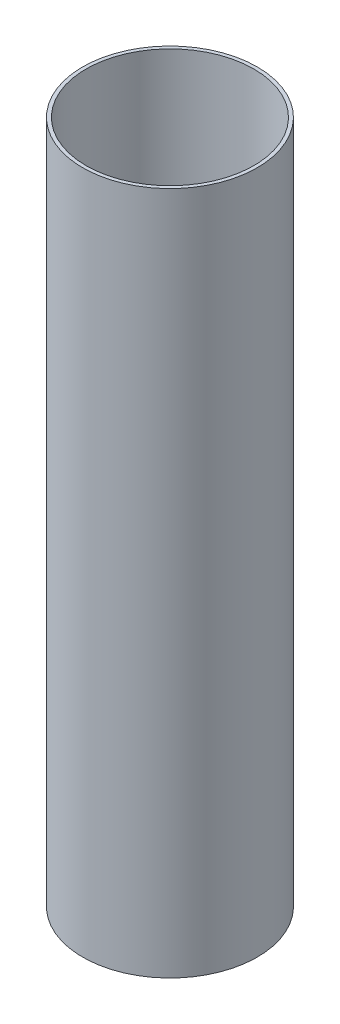
ISO-10303-21;
HEADER;
FILE_DESCRIPTION(('STEP AP214'),'2;1');
FILE_NAME('part.step','',(''),(''),'','','');
FILE_SCHEMA(('AUTOMOTIVE_DESIGN { 1 0 10303 214 1 1 1 1 }'));
ENDSEC;
DATA;
#1=APPLICATION_CONTEXT('core data for automotive mechanical design processes');
#2=APPLICATION_PROTOCOL_DEFINITION('international standard','automotive_design',2000,#1);
#3=PRODUCT_CONTEXT('',#1,'mechanical');
#4=PRODUCT('Part','Part','',(#3));
#5=PRODUCT_RELATED_PRODUCT_CATEGORY('part','',(#4));
#6=PRODUCT_DEFINITION_FORMATION('','',#4);
#7=PRODUCT_DEFINITION_CONTEXT('part definition',#1,'design');
#8=PRODUCT_DEFINITION('design','',#6,#7);
#9=PRODUCT_DEFINITION_SHAPE('','',#8);
#10=(LENGTH_UNIT() NAMED_UNIT(*) SI_UNIT(.MILLI.,.METRE.));
#11=(NAMED_UNIT(*) PLANE_ANGLE_UNIT() SI_UNIT($,.RADIAN.));
#12=(NAMED_UNIT(*) SI_UNIT($,.STERADIAN.) SOLID_ANGLE_UNIT());
#13=UNCERTAINTY_MEASURE_WITH_UNIT(LENGTH_MEASURE(1.E-05),#10,'distance_accuracy_value','');
#14=(GEOMETRIC_REPRESENTATION_CONTEXT(3) GLOBAL_UNCERTAINTY_ASSIGNED_CONTEXT((#13)) GLOBAL_UNIT_ASSIGNED_CONTEXT((#10,
#11,#12)) REPRESENTATION_CONTEXT('',''));
#15=CARTESIAN_POINT('',(0.,0.,0.));
#16=DIRECTION('',(0.,0.,1.));
#17=DIRECTION('',(1.,0.,0.));
#18=AXIS2_PLACEMENT_3D('',#15,#16,#17);
#19=CARTESIAN_POINT('',(44.45,-43.1799999999999,0.));
#20=DIRECTION('',(0.,-1.,0.));
#21=DIRECTION('',(0.,0.,-1.));
#22=AXIS2_PLACEMENT_3D('',#19,#20,#21);
#23=PLANE('',#22);
#24=CARTESIAN_POINT('',(0.,-43.1799999999999,0.));
#25=DIRECTION('',(0.,-1.,0.));
#26=DIRECTION('',(0.,0.,-1.));
#27=AXIS2_PLACEMENT_3D('',#24,#25,#26);
#28=CIRCLE('',#27,44.45);
#29=CARTESIAN_POINT('',(0.,-43.1799999999999,-44.45));
#30=VERTEX_POINT('',#29);
#31=EDGE_CURVE('E47',#30,#30,#28,.T.);
#32=ORIENTED_EDGE('',*,*,#31,.T.);
#33=EDGE_LOOP('',(#32));
#34=FACE_BOUND('',#33,.T.);
#35=CARTESIAN_POINT('',(0.,-43.18,0.));
#36=DIRECTION('',(0.,-1.,0.));
#37=DIRECTION('',(0.,0.,-1.));
#38=AXIS2_PLACEMENT_3D('',#35,#36,#37);
#39=CIRCLE('',#38,42.672);
#40=CARTESIAN_POINT('',(0.,-43.18,-42.672));
#41=VERTEX_POINT('',#40);
#42=EDGE_CURVE('E10',#41,#41,#39,.T.);
#43=ORIENTED_EDGE('',*,*,#42,.F.);
#44=EDGE_LOOP('',(#43));
#45=FACE_BOUND('',#44,.T.);
#46=ADVANCED_FACE('F33',(#34,#45),#23,.T.);
#47=CARTESIAN_POINT('',(0.,0.,0.));
#48=DIRECTION('',(0.,-1.,0.));
#49=DIRECTION('',(0.,0.,-1.));
#50=AXIS2_PLACEMENT_3D('',#47,#48,#49);
#51=CYLINDRICAL_SURFACE('',#50,42.672);
#52=ORIENTED_EDGE('',*,*,#42,.T.);
#53=EDGE_LOOP('',(#52));
#54=FACE_BOUND('',#53,.T.);
#55=CARTESIAN_POINT('',(0.,304.8,0.));
#56=DIRECTION('',(0.,-1.,0.));
#57=DIRECTION('',(0.,0.,-1.));
#58=AXIS2_PLACEMENT_3D('',#55,#56,#57);
#59=CIRCLE('',#58,42.672);
#60=CARTESIAN_POINT('',(0.,304.8,-42.672));
#61=VERTEX_POINT('',#60);
#62=EDGE_CURVE('E39',#61,#61,#59,.T.);
#63=ORIENTED_EDGE('',*,*,#62,.F.);
#64=EDGE_LOOP('',(#63));
#65=FACE_BOUND('',#64,.T.);
#66=ADVANCED_FACE('F63',(#54,#65),#51,.F.);
#67=CARTESIAN_POINT('',(42.672,304.8,0.));
#68=DIRECTION('',(0.,1.,0.));
#69=DIRECTION('',(0.,0.,1.));
#70=AXIS2_PLACEMENT_3D('',#67,#68,#69);
#71=PLANE('',#70);
#72=ORIENTED_EDGE('',*,*,#62,.T.);
#73=EDGE_LOOP('',(#72));
#74=FACE_BOUND('',#73,.T.);
#75=CARTESIAN_POINT('',(0.,304.8,0.));
#76=DIRECTION('',(0.,-1.,0.));
#77=DIRECTION('',(0.,0.,-1.));
#78=AXIS2_PLACEMENT_3D('',#75,#76,#77);
#79=CIRCLE('',#78,44.45);
#80=CARTESIAN_POINT('',(0.,304.8,-44.45));
#81=VERTEX_POINT('',#80);
#82=EDGE_CURVE('E43',#81,#81,#79,.T.);
#83=ORIENTED_EDGE('',*,*,#82,.F.);
#84=EDGE_LOOP('',(#83));
#85=FACE_BOUND('',#84,.T.);
#86=ADVANCED_FACE('F57',(#74,#85),#71,.T.);
#87=CARTESIAN_POINT('',(0.,0.,0.));
#88=DIRECTION('',(0.,-1.,0.));
#89=DIRECTION('',(0.,0.,-1.));
#90=AXIS2_PLACEMENT_3D('',#87,#88,#89);
#91=CYLINDRICAL_SURFACE('',#90,44.45);
#92=ORIENTED_EDGE('',*,*,#82,.T.);
#93=EDGE_LOOP('',(#92));
#94=FACE_BOUND('',#93,.T.);
#95=ORIENTED_EDGE('',*,*,#31,.F.);
#96=EDGE_LOOP('',(#95));
#97=FACE_BOUND('',#96,.T.);
#98=ADVANCED_FACE('F55',(#94,#97),#91,.T.);
#99=CLOSED_SHELL('',(#46,#66,#86,#98));
#100=MANIFOLD_SOLID_BREP('B2',#99);
#101=ADVANCED_BREP_SHAPE_REPRESENTATION('',(#18,#100),#14);
#102=SHAPE_DEFINITION_REPRESENTATION(#9,#101);
ENDSEC;
END-ISO-10303-21;
